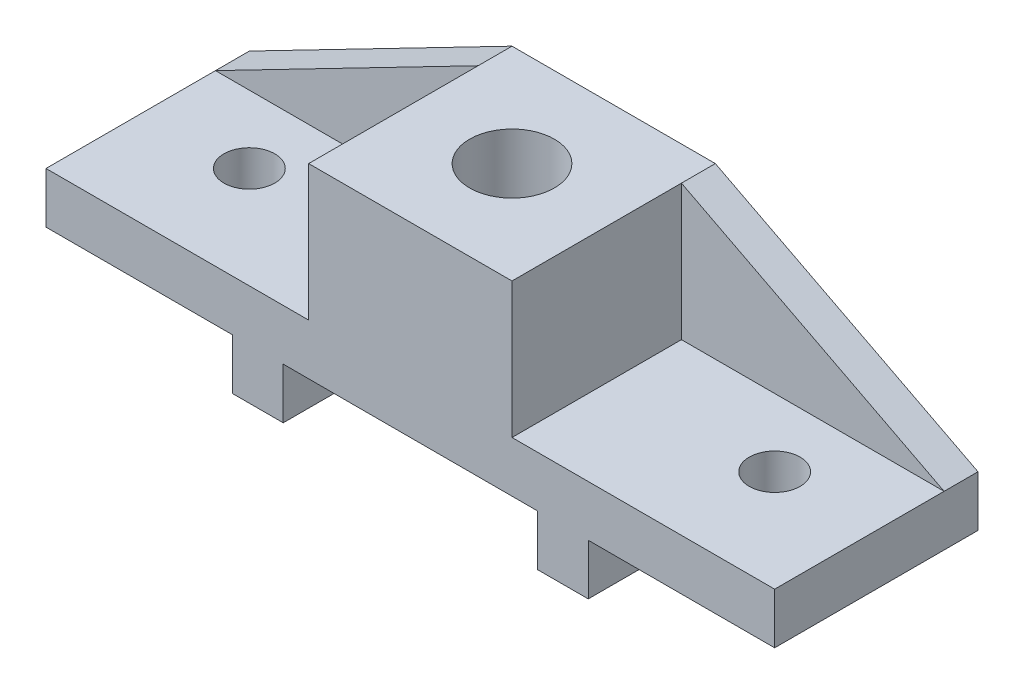
ISO-10303-21;
HEADER;
FILE_DESCRIPTION(('STEP AP214'),'2;1');
FILE_NAME('part.step','',(''),(''),'','','');
FILE_SCHEMA(('AUTOMOTIVE_DESIGN { 1 0 10303 214 1 1 1 1 }'));
ENDSEC;
DATA;
#1=APPLICATION_CONTEXT('core data for automotive mechanical design processes');
#2=APPLICATION_PROTOCOL_DEFINITION('international standard','automotive_design',2000,#1);
#3=PRODUCT_CONTEXT('',#1,'mechanical');
#4=PRODUCT('Part','Part','',(#3));
#5=PRODUCT_RELATED_PRODUCT_CATEGORY('part','',(#4));
#6=PRODUCT_DEFINITION_FORMATION('','',#4);
#7=PRODUCT_DEFINITION_CONTEXT('part definition',#1,'design');
#8=PRODUCT_DEFINITION('design','',#6,#7);
#9=PRODUCT_DEFINITION_SHAPE('','',#8);
#10=(LENGTH_UNIT() NAMED_UNIT(*) SI_UNIT(.MILLI.,.METRE.));
#11=(NAMED_UNIT(*) PLANE_ANGLE_UNIT() SI_UNIT($,.RADIAN.));
#12=(NAMED_UNIT(*) SI_UNIT($,.STERADIAN.) SOLID_ANGLE_UNIT());
#13=UNCERTAINTY_MEASURE_WITH_UNIT(LENGTH_MEASURE(1.E-05),#10,'distance_accuracy_value','');
#14=(GEOMETRIC_REPRESENTATION_CONTEXT(3) GLOBAL_UNCERTAINTY_ASSIGNED_CONTEXT((#13)) GLOBAL_UNIT_ASSIGNED_CONTEXT((#10,
#11,#12)) REPRESENTATION_CONTEXT('',''));
#15=CARTESIAN_POINT('',(0.,0.,0.));
#16=DIRECTION('',(0.,0.,1.));
#17=DIRECTION('',(1.,0.,0.));
#18=AXIS2_PLACEMENT_3D('',#15,#16,#17);
#19=CARTESIAN_POINT('',(174.625,69.85,-76.2));
#20=DIRECTION('',(1.,0.,0.));
#21=DIRECTION('',(0.,0.,-1.));
#22=AXIS2_PLACEMENT_3D('',#19,#20,#21);
#23=PLANE('',#22);
#24=DIRECTION('',(0.,0.,1.));
#25=VECTOR('',#24,1.);
#26=CARTESIAN_POINT('',(174.625,19.05,-76.2));
#27=LINE('',#26,#25);
#28=CARTESIAN_POINT('',(174.625,19.05,-63.5));
#29=VERTEX_POINT('',#28);
#30=CARTESIAN_POINT('',(174.625,19.05,0.));
#31=VERTEX_POINT('',#30);
#32=EDGE_CURVE('E289',#29,#31,#27,.T.);
#33=ORIENTED_EDGE('',*,*,#32,.F.);
#34=DIRECTION('',(0.,1.,0.));
#35=VECTOR('',#34,1.);
#36=CARTESIAN_POINT('',(174.625,69.85,-63.5));
#37=LINE('',#36,#35);
#38=CARTESIAN_POINT('',(174.625,69.85,-63.5));
#39=VERTEX_POINT('',#38);
#40=EDGE_CURVE('E50',#29,#39,#37,.T.);
#41=ORIENTED_EDGE('',*,*,#40,.T.);
#42=DIRECTION('',(0.,0.,1.));
#43=VECTOR('',#42,1.);
#44=CARTESIAN_POINT('',(174.625,69.85,-76.2));
#45=LINE('',#44,#43);
#46=CARTESIAN_POINT('',(174.625,69.85,0.));
#47=VERTEX_POINT('',#46);
#48=EDGE_CURVE('E178',#39,#47,#45,.T.);
#49=ORIENTED_EDGE('',*,*,#48,.T.);
#50=DIRECTION('',(0.,1.,0.));
#51=VECTOR('',#50,1.);
#52=CARTESIAN_POINT('',(174.625,69.85,0.));
#53=LINE('',#52,#51);
#54=EDGE_CURVE('E274',#31,#47,#53,.T.);
#55=ORIENTED_EDGE('',*,*,#54,.F.);
#56=EDGE_LOOP('',(#33,#41,#49,#55));
#57=FACE_BOUND('',#56,.T.);
#58=ADVANCED_FACE('F33',(#57),#23,.T.);
#59=CARTESIAN_POINT('',(174.625,19.05,-76.2));
#60=DIRECTION('',(0.,1.,0.));
#61=DIRECTION('',(0.,0.,1.));
#62=AXIS2_PLACEMENT_3D('',#59,#60,#61);
#63=PLANE('',#62);
#64=CARTESIAN_POINT('',(234.95,19.05,-38.1));
#65=DIRECTION('',(0.,1.,0.));
#66=DIRECTION('',(0.,0.,1.));
#67=AXIS2_PLACEMENT_3D('',#64,#65,#66);
#68=CIRCLE('',#67,9.525);
#69=CARTESIAN_POINT('',(234.95,19.05,-28.575));
#70=VERTEX_POINT('',#69);
#71=EDGE_CURVE('E313',#70,#70,#68,.T.);
#72=ORIENTED_EDGE('',*,*,#71,.F.);
#73=EDGE_LOOP('',(#72));
#74=FACE_BOUND('',#73,.T.);
#75=DIRECTION('',(0.,0.,1.));
#76=VECTOR('',#75,1.);
#77=CARTESIAN_POINT('',(273.05,19.05,-76.2));
#78=LINE('',#77,#76);
#79=CARTESIAN_POINT('',(273.05,19.05,-63.5));
#80=VERTEX_POINT('',#79);
#81=CARTESIAN_POINT('',(273.05,19.05,0.));
#82=VERTEX_POINT('',#81);
#83=EDGE_CURVE('E292',#80,#82,#78,.T.);
#84=ORIENTED_EDGE('',*,*,#83,.F.);
#85=DIRECTION('',(-1.,0.,0.));
#86=VECTOR('',#85,1.);
#87=CARTESIAN_POINT('',(174.625,19.05,-63.5));
#88=LINE('',#87,#86);
#89=EDGE_CURVE('E58',#80,#29,#88,.T.);
#90=ORIENTED_EDGE('',*,*,#89,.T.);
#91=ORIENTED_EDGE('',*,*,#32,.T.);
#92=DIRECTION('',(-1.,0.,0.));
#93=VECTOR('',#92,1.);
#94=CARTESIAN_POINT('',(174.625,19.05,0.));
#95=LINE('',#94,#93);
#96=EDGE_CURVE('E271',#82,#31,#95,.T.);
#97=ORIENTED_EDGE('',*,*,#96,.F.);
#98=EDGE_LOOP('',(#84,#90,#91,#97));
#99=FACE_BOUND('',#98,.T.);
#100=ADVANCED_FACE('F341',(#74,#99),#63,.T.);
#101=CARTESIAN_POINT('',(98.425,19.05,-76.2));
#102=DIRECTION('',(0.,1.,0.));
#103=DIRECTION('',(-1.,0.,0.));
#104=AXIS2_PLACEMENT_3D('',#101,#102,#103);
#105=PLANE('',#104);
#106=CARTESIAN_POINT('',(38.1,19.05,-38.1));
#107=DIRECTION('',(0.,1.,0.));
#108=DIRECTION('',(0.,0.,1.));
#109=AXIS2_PLACEMENT_3D('',#106,#107,#108);
#110=CIRCLE('',#109,9.525);
#111=CARTESIAN_POINT('',(38.1,19.05,-28.575));
#112=VERTEX_POINT('',#111);
#113=EDGE_CURVE('E318',#112,#112,#110,.T.);
#114=ORIENTED_EDGE('',*,*,#113,.F.);
#115=EDGE_LOOP('',(#114));
#116=FACE_BOUND('',#115,.T.);
#117=DIRECTION('',(0.,0.,1.));
#118=VECTOR('',#117,1.);
#119=CARTESIAN_POINT('',(98.425,19.05,-76.2));
#120=LINE('',#119,#118);
#121=CARTESIAN_POINT('',(98.425,19.05,-63.5));
#122=VERTEX_POINT('',#121);
#123=CARTESIAN_POINT('',(98.425,19.05,0.));
#124=VERTEX_POINT('',#123);
#125=EDGE_CURVE('E285',#122,#124,#120,.T.);
#126=ORIENTED_EDGE('',*,*,#125,.F.);
#127=DIRECTION('',(-1.,0.,0.));
#128=VECTOR('',#127,1.);
#129=CARTESIAN_POINT('',(98.425,19.05,-63.5));
#130=LINE('',#129,#128);
#131=CARTESIAN_POINT('',(0.,19.05,-63.5));
#132=VERTEX_POINT('',#131);
#133=EDGE_CURVE('E200',#122,#132,#130,.T.);
#134=ORIENTED_EDGE('',*,*,#133,.T.);
#135=DIRECTION('',(0.,0.,1.));
#136=VECTOR('',#135,1.);
#137=CARTESIAN_POINT('',(0.,19.05,-76.2));
#138=LINE('',#137,#136);
#139=CARTESIAN_POINT('',(0.,19.05,0.));
#140=VERTEX_POINT('',#139);
#141=EDGE_CURVE('E42',#132,#140,#138,.T.);
#142=ORIENTED_EDGE('',*,*,#141,.T.);
#143=DIRECTION('',(-1.,0.,0.));
#144=VECTOR('',#143,1.);
#145=CARTESIAN_POINT('',(98.425,19.05,0.));
#146=LINE('',#145,#144);
#147=EDGE_CURVE('E211',#124,#140,#146,.T.);
#148=ORIENTED_EDGE('',*,*,#147,.F.);
#149=EDGE_LOOP('',(#126,#134,#142,#148));
#150=FACE_BOUND('',#149,.T.);
#151=ADVANCED_FACE('F346',(#116,#150),#105,.T.);
#152=CARTESIAN_POINT('',(98.425,69.85,-76.2));
#153=DIRECTION('',(-1.,0.,0.));
#154=DIRECTION('',(0.,0.,1.));
#155=AXIS2_PLACEMENT_3D('',#152,#153,#154);
#156=PLANE('',#155);
#157=DIRECTION('',(0.,0.,1.));
#158=VECTOR('',#157,1.);
#159=CARTESIAN_POINT('',(98.425,69.85,-76.2));
#160=LINE('',#159,#158);
#161=CARTESIAN_POINT('',(98.425,69.85,-63.5));
#162=VERTEX_POINT('',#161);
#163=CARTESIAN_POINT('',(98.425,69.85,0.));
#164=VERTEX_POINT('',#163);
#165=EDGE_CURVE('E182',#162,#164,#160,.T.);
#166=ORIENTED_EDGE('',*,*,#165,.F.);
#167=DIRECTION('',(0.,-1.,0.));
#168=VECTOR('',#167,1.);
#169=CARTESIAN_POINT('',(98.425,69.85,-63.5));
#170=LINE('',#169,#168);
#171=EDGE_CURVE('E198',#162,#122,#170,.T.);
#172=ORIENTED_EDGE('',*,*,#171,.T.);
#173=ORIENTED_EDGE('',*,*,#125,.T.);
#174=DIRECTION('',(0.,-1.,0.));
#175=VECTOR('',#174,1.);
#176=CARTESIAN_POINT('',(98.425,69.85,0.));
#177=LINE('',#176,#175);
#178=EDGE_CURVE('E280',#164,#124,#177,.T.);
#179=ORIENTED_EDGE('',*,*,#178,.F.);
#180=EDGE_LOOP('',(#166,#172,#173,#179));
#181=FACE_BOUND('',#180,.T.);
#182=ADVANCED_FACE('F428',(#181),#156,.T.);
#183=CARTESIAN_POINT('',(0.,0.,-76.2));
#184=DIRECTION('',(-1.,0.,0.));
#185=DIRECTION('',(0.,0.,1.));
#186=AXIS2_PLACEMENT_3D('',#183,#184,#185);
#187=PLANE('',#186);
#188=DIRECTION('',(0.,-1.,0.));
#189=VECTOR('',#188,1.);
#190=CARTESIAN_POINT('',(0.,0.,0.));
#191=LINE('',#190,#189);
#192=CARTESIAN_POINT('',(0.,0.,0.));
#193=VERTEX_POINT('',#192);
#194=EDGE_CURVE('E205',#140,#193,#191,.T.);
#195=ORIENTED_EDGE('',*,*,#194,.F.);
#196=ORIENTED_EDGE('',*,*,#141,.F.);
#197=CARTESIAN_POINT('',(0.,19.05,-76.2));
#198=VERTEX_POINT('',#197);
#199=EDGE_CURVE('E11',#198,#132,#138,.T.);
#200=ORIENTED_EDGE('',*,*,#199,.F.);
#201=DIRECTION('',(0.,-1.,0.));
#202=VECTOR('',#201,1.);
#203=CARTESIAN_POINT('',(0.,0.,-76.2));
#204=LINE('',#203,#202);
#205=CARTESIAN_POINT('',(0.,0.,-76.2));
#206=VERTEX_POINT('',#205);
#207=EDGE_CURVE('E207',#198,#206,#204,.T.);
#208=ORIENTED_EDGE('',*,*,#207,.T.);
#209=DIRECTION('',(0.,0.,1.));
#210=VECTOR('',#209,1.);
#211=CARTESIAN_POINT('',(0.,0.,-76.2));
#212=LINE('',#211,#210);
#213=EDGE_CURVE('E171',#206,#193,#212,.T.);
#214=ORIENTED_EDGE('',*,*,#213,.T.);
#215=EDGE_LOOP('',(#195,#196,#200,#208,#214));
#216=FACE_BOUND('',#215,.T.);
#217=ADVANCED_FACE('F35',(#216),#187,.T.);
#218=CARTESIAN_POINT('',(98.425,69.85,-76.2));
#219=DIRECTION('',(0.,1.,0.));
#220=DIRECTION('',(-1.,0.,0.));
#221=AXIS2_PLACEMENT_3D('',#218,#219,#220);
#222=PLANE('',#221);
#223=CARTESIAN_POINT('',(136.525,69.85,-38.1));
#224=DIRECTION('',(0.,1.,0.));
#225=DIRECTION('',(-1.,0.,0.));
#226=AXIS2_PLACEMENT_3D('',#223,#224,#225);
#227=CIRCLE('',#226,15.875);
#228=CARTESIAN_POINT('',(120.65,69.85,-38.1));
#229=VERTEX_POINT('',#228);
#230=EDGE_CURVE('E192',#229,#229,#227,.T.);
#231=ORIENTED_EDGE('',*,*,#230,.F.);
#232=EDGE_LOOP('',(#231));
#233=FACE_BOUND('',#232,.T.);
#234=DIRECTION('',(-1.,0.,0.));
#235=VECTOR('',#234,1.);
#236=CARTESIAN_POINT('',(98.425,69.85,0.));
#237=LINE('',#236,#235);
#238=EDGE_CURVE('E277',#47,#164,#237,.T.);
#239=ORIENTED_EDGE('',*,*,#238,.F.);
#240=ORIENTED_EDGE('',*,*,#48,.F.);
#241=CARTESIAN_POINT('',(174.625,69.85,-76.2));
#242=VERTEX_POINT('',#241);
#243=EDGE_CURVE('E175',#242,#39,#45,.T.);
#244=ORIENTED_EDGE('',*,*,#243,.F.);
#245=DIRECTION('',(-1.,0.,0.));
#246=VECTOR('',#245,1.);
#247=CARTESIAN_POINT('',(98.425,69.85,-76.2));
#248=LINE('',#247,#246);
#249=CARTESIAN_POINT('',(98.425,69.85,-76.2));
#250=VERTEX_POINT('',#249);
#251=EDGE_CURVE('E160',#242,#250,#248,.T.);
#252=ORIENTED_EDGE('',*,*,#251,.T.);
#253=EDGE_CURVE('E287',#250,#162,#160,.T.);
#254=ORIENTED_EDGE('',*,*,#253,.T.);
#255=ORIENTED_EDGE('',*,*,#165,.T.);
#256=EDGE_LOOP('',(#239,#240,#244,#252,#254,#255));
#257=FACE_BOUND('',#256,.T.);
#258=ADVANCED_FACE('F177',(#233,#257),#222,.T.);
#259=CARTESIAN_POINT('',(273.05,0.,-76.2));
#260=DIRECTION('',(1.,0.,0.));
#261=DIRECTION('',(0.,0.,-1.));
#262=AXIS2_PLACEMENT_3D('',#259,#260,#261);
#263=PLANE('',#262);
#264=DIRECTION('',(0.,1.,0.));
#265=VECTOR('',#264,1.);
#266=CARTESIAN_POINT('',(273.05,0.,0.));
#267=LINE('',#266,#265);
#268=CARTESIAN_POINT('',(273.05,0.,0.));
#269=VERTEX_POINT('',#268);
#270=EDGE_CURVE('E268',#269,#82,#267,.T.);
#271=ORIENTED_EDGE('',*,*,#270,.F.);
#272=DIRECTION('',(0.,0.,1.));
#273=VECTOR('',#272,1.);
#274=CARTESIAN_POINT('',(273.05,0.,-76.2));
#275=LINE('',#274,#273);
#276=CARTESIAN_POINT('',(273.05,0.,-76.2));
#277=VERTEX_POINT('',#276);
#278=EDGE_CURVE('E293',#277,#269,#275,.T.);
#279=ORIENTED_EDGE('',*,*,#278,.F.);
#280=DIRECTION('',(0.,1.,0.));
#281=VECTOR('',#280,1.);
#282=CARTESIAN_POINT('',(273.05,0.,-76.2));
#283=LINE('',#282,#281);
#284=CARTESIAN_POINT('',(273.05,19.05,-76.2));
#285=VERTEX_POINT('',#284);
#286=EDGE_CURVE('E172',#277,#285,#283,.T.);
#287=ORIENTED_EDGE('',*,*,#286,.T.);
#288=EDGE_CURVE('E187',#285,#80,#78,.T.);
#289=ORIENTED_EDGE('',*,*,#288,.T.);
#290=ORIENTED_EDGE('',*,*,#83,.T.);
#291=EDGE_LOOP('',(#271,#279,#287,#289,#290));
#292=FACE_BOUND('',#291,.T.);
#293=ADVANCED_FACE('F352',(#292),#263,.T.);
#294=CARTESIAN_POINT('',(203.2,0.,-76.2));
#295=DIRECTION('',(0.,-1.,0.));
#296=DIRECTION('',(0.,0.,-1.));
#297=AXIS2_PLACEMENT_3D('',#294,#295,#296);
#298=PLANE('',#297);
#299=CARTESIAN_POINT('',(234.95,0.,-38.1));
#300=DIRECTION('',(0.,-1.,0.));
#301=DIRECTION('',(0.,0.,-1.));
#302=AXIS2_PLACEMENT_3D('',#299,#300,#301);
#303=CIRCLE('',#302,9.525);
#304=CARTESIAN_POINT('',(234.95,0.,-47.625));
#305=VERTEX_POINT('',#304);
#306=EDGE_CURVE('E37',#305,#305,#303,.T.);
#307=ORIENTED_EDGE('',*,*,#306,.F.);
#308=EDGE_LOOP('',(#307));
#309=FACE_BOUND('',#308,.T.);
#310=DIRECTION('',(1.,0.,0.));
#311=VECTOR('',#310,1.);
#312=CARTESIAN_POINT('',(203.2,0.,0.));
#313=LINE('',#312,#311);
#314=CARTESIAN_POINT('',(203.2,0.,0.));
#315=VERTEX_POINT('',#314);
#316=EDGE_CURVE('E265',#315,#269,#313,.T.);
#317=ORIENTED_EDGE('',*,*,#316,.F.);
#318=DIRECTION('',(0.,0.,1.));
#319=VECTOR('',#318,1.);
#320=CARTESIAN_POINT('',(203.2,0.,-76.2));
#321=LINE('',#320,#319);
#322=CARTESIAN_POINT('',(203.2,0.,-76.2));
#323=VERTEX_POINT('',#322);
#324=EDGE_CURVE('E295',#323,#315,#321,.T.);
#325=ORIENTED_EDGE('',*,*,#324,.F.);
#326=DIRECTION('',(1.,0.,0.));
#327=VECTOR('',#326,1.);
#328=CARTESIAN_POINT('',(203.2,0.,-76.2));
#329=LINE('',#328,#327);
#330=EDGE_CURVE('E235',#323,#277,#329,.T.);
#331=ORIENTED_EDGE('',*,*,#330,.T.);
#332=ORIENTED_EDGE('',*,*,#278,.T.);
#333=EDGE_LOOP('',(#317,#325,#331,#332));
#334=FACE_BOUND('',#333,.T.);
#335=ADVANCED_FACE('F355',(#309,#334),#298,.T.);
#336=CARTESIAN_POINT('',(203.2,-19.05,-76.2));
#337=DIRECTION('',(1.,0.,0.));
#338=DIRECTION('',(0.,1.,0.));
#339=AXIS2_PLACEMENT_3D('',#336,#337,#338);
#340=PLANE('',#339);
#341=DIRECTION('',(0.,1.,0.));
#342=VECTOR('',#341,1.);
#343=CARTESIAN_POINT('',(203.2,-19.05,0.));
#344=LINE('',#343,#342);
#345=CARTESIAN_POINT('',(203.2,-19.05,0.));
#346=VERTEX_POINT('',#345);
#347=EDGE_CURVE('E262',#346,#315,#344,.T.);
#348=ORIENTED_EDGE('',*,*,#347,.F.);
#349=DIRECTION('',(0.,0.,1.));
#350=VECTOR('',#349,1.);
#351=CARTESIAN_POINT('',(203.2,-19.05,-76.2));
#352=LINE('',#351,#350);
#353=CARTESIAN_POINT('',(203.2,-19.05,-76.2));
#354=VERTEX_POINT('',#353);
#355=EDGE_CURVE('E297',#354,#346,#352,.T.);
#356=ORIENTED_EDGE('',*,*,#355,.F.);
#357=DIRECTION('',(0.,1.,0.));
#358=VECTOR('',#357,1.);
#359=CARTESIAN_POINT('',(203.2,-19.05,-76.2));
#360=LINE('',#359,#358);
#361=EDGE_CURVE('E232',#354,#323,#360,.T.);
#362=ORIENTED_EDGE('',*,*,#361,.T.);
#363=ORIENTED_EDGE('',*,*,#324,.T.);
#364=EDGE_LOOP('',(#348,#356,#362,#363));
#365=FACE_BOUND('',#364,.T.);
#366=ADVANCED_FACE('F359',(#365),#340,.T.);
#367=CARTESIAN_POINT('',(184.15,-19.05,-76.2));
#368=DIRECTION('',(0.,-1.,0.));
#369=DIRECTION('',(0.,0.,-1.));
#370=AXIS2_PLACEMENT_3D('',#367,#368,#369);
#371=PLANE('',#370);
#372=DIRECTION('',(1.,0.,0.));
#373=VECTOR('',#372,1.);
#374=CARTESIAN_POINT('',(184.15,-19.05,0.));
#375=LINE('',#374,#373);
#376=CARTESIAN_POINT('',(184.15,-19.05,0.));
#377=VERTEX_POINT('',#376);
#378=EDGE_CURVE('E259',#377,#346,#375,.T.);
#379=ORIENTED_EDGE('',*,*,#378,.F.);
#380=DIRECTION('',(0.,0.,1.));
#381=VECTOR('',#380,1.);
#382=CARTESIAN_POINT('',(184.15,-19.05,-76.2));
#383=LINE('',#382,#381);
#384=CARTESIAN_POINT('',(184.15,-19.05,-76.2));
#385=VERTEX_POINT('',#384);
#386=EDGE_CURVE('E299',#385,#377,#383,.T.);
#387=ORIENTED_EDGE('',*,*,#386,.F.);
#388=DIRECTION('',(1.,0.,0.));
#389=VECTOR('',#388,1.);
#390=CARTESIAN_POINT('',(184.15,-19.05,-76.2));
#391=LINE('',#390,#389);
#392=EDGE_CURVE('E229',#385,#354,#391,.T.);
#393=ORIENTED_EDGE('',*,*,#392,.T.);
#394=ORIENTED_EDGE('',*,*,#355,.T.);
#395=EDGE_LOOP('',(#379,#387,#393,#394));
#396=FACE_BOUND('',#395,.T.);
#397=ADVANCED_FACE('F363',(#396),#371,.T.);
#398=CARTESIAN_POINT('',(184.15,0.,-76.2));
#399=DIRECTION('',(-1.,0.,0.));
#400=DIRECTION('',(0.,-1.,0.));
#401=AXIS2_PLACEMENT_3D('',#398,#399,#400);
#402=PLANE('',#401);
#403=DIRECTION('',(0.,-1.,0.));
#404=VECTOR('',#403,1.);
#405=CARTESIAN_POINT('',(184.15,0.,0.));
#406=LINE('',#405,#404);
#407=CARTESIAN_POINT('',(184.15,0.,0.));
#408=VERTEX_POINT('',#407);
#409=EDGE_CURVE('E256',#408,#377,#406,.T.);
#410=ORIENTED_EDGE('',*,*,#409,.F.);
#411=DIRECTION('',(0.,0.,1.));
#412=VECTOR('',#411,1.);
#413=CARTESIAN_POINT('',(184.15,0.,-76.2));
#414=LINE('',#413,#412);
#415=CARTESIAN_POINT('',(184.15,0.,-76.2));
#416=VERTEX_POINT('',#415);
#417=EDGE_CURVE('E301',#416,#408,#414,.T.);
#418=ORIENTED_EDGE('',*,*,#417,.F.);
#419=DIRECTION('',(0.,-1.,0.));
#420=VECTOR('',#419,1.);
#421=CARTESIAN_POINT('',(184.15,0.,-76.2));
#422=LINE('',#421,#420);
#423=EDGE_CURVE('E226',#416,#385,#422,.T.);
#424=ORIENTED_EDGE('',*,*,#423,.T.);
#425=ORIENTED_EDGE('',*,*,#386,.T.);
#426=EDGE_LOOP('',(#410,#418,#424,#425));
#427=FACE_BOUND('',#426,.T.);
#428=ADVANCED_FACE('F367',(#427),#402,.T.);
#429=CARTESIAN_POINT('',(88.9,0.,-76.2));
#430=DIRECTION('',(0.,-1.,0.));
#431=DIRECTION('',(0.,0.,-1.));
#432=AXIS2_PLACEMENT_3D('',#429,#430,#431);
#433=PLANE('',#432);
#434=CARTESIAN_POINT('',(136.525,0.,-38.1));
#435=DIRECTION('',(0.,-1.,0.));
#436=DIRECTION('',(0.,0.,-1.));
#437=AXIS2_PLACEMENT_3D('',#434,#435,#436);
#438=CIRCLE('',#437,15.875);
#439=CARTESIAN_POINT('',(120.65,0.,-38.1));
#440=VERTEX_POINT('',#439);
#441=EDGE_CURVE('E188',#440,#440,#438,.T.);
#442=ORIENTED_EDGE('',*,*,#441,.F.);
#443=EDGE_LOOP('',(#442));
#444=FACE_BOUND('',#443,.T.);
#445=DIRECTION('',(1.,0.,0.));
#446=VECTOR('',#445,1.);
#447=CARTESIAN_POINT('',(88.9,0.,0.));
#448=LINE('',#447,#446);
#449=CARTESIAN_POINT('',(88.9,0.,0.));
#450=VERTEX_POINT('',#449);
#451=EDGE_CURVE('E253',#450,#408,#448,.T.);
#452=ORIENTED_EDGE('',*,*,#451,.F.);
#453=DIRECTION('',(0.,0.,1.));
#454=VECTOR('',#453,1.);
#455=CARTESIAN_POINT('',(88.9,0.,-76.2));
#456=LINE('',#455,#454);
#457=CARTESIAN_POINT('',(88.9,0.,-76.2));
#458=VERTEX_POINT('',#457);
#459=EDGE_CURVE('E303',#458,#450,#456,.T.);
#460=ORIENTED_EDGE('',*,*,#459,.F.);
#461=DIRECTION('',(1.,0.,0.));
#462=VECTOR('',#461,1.);
#463=CARTESIAN_POINT('',(88.9,0.,-76.2));
#464=LINE('',#463,#462);
#465=EDGE_CURVE('E223',#458,#416,#464,.T.);
#466=ORIENTED_EDGE('',*,*,#465,.T.);
#467=ORIENTED_EDGE('',*,*,#417,.T.);
#468=EDGE_LOOP('',(#452,#460,#466,#467));
#469=FACE_BOUND('',#468,.T.);
#470=ADVANCED_FACE('F371',(#444,#469),#433,.T.);
#471=CARTESIAN_POINT('',(88.9,-19.05,-76.2));
#472=DIRECTION('',(1.,0.,0.));
#473=DIRECTION('',(0.,0.,-1.));
#474=AXIS2_PLACEMENT_3D('',#471,#472,#473);
#475=PLANE('',#474);
#476=DIRECTION('',(0.,1.,0.));
#477=VECTOR('',#476,1.);
#478=CARTESIAN_POINT('',(88.9,-19.05,0.));
#479=LINE('',#478,#477);
#480=CARTESIAN_POINT('',(88.9,-19.05,0.));
#481=VERTEX_POINT('',#480);
#482=EDGE_CURVE('E250',#481,#450,#479,.T.);
#483=ORIENTED_EDGE('',*,*,#482,.F.);
#484=DIRECTION('',(0.,0.,1.));
#485=VECTOR('',#484,1.);
#486=CARTESIAN_POINT('',(88.9,-19.05,-76.2));
#487=LINE('',#486,#485);
#488=CARTESIAN_POINT('',(88.9,-19.05,-76.2));
#489=VERTEX_POINT('',#488);
#490=EDGE_CURVE('E305',#489,#481,#487,.T.);
#491=ORIENTED_EDGE('',*,*,#490,.F.);
#492=DIRECTION('',(0.,1.,0.));
#493=VECTOR('',#492,1.);
#494=CARTESIAN_POINT('',(88.9,-19.05,-76.2));
#495=LINE('',#494,#493);
#496=EDGE_CURVE('E220',#489,#458,#495,.T.);
#497=ORIENTED_EDGE('',*,*,#496,.T.);
#498=ORIENTED_EDGE('',*,*,#459,.T.);
#499=EDGE_LOOP('',(#483,#491,#497,#498));
#500=FACE_BOUND('',#499,.T.);
#501=ADVANCED_FACE('F375',(#500),#475,.T.);
#502=CARTESIAN_POINT('',(69.85,-19.05,-76.2));
#503=DIRECTION('',(0.,-1.,0.));
#504=DIRECTION('',(1.,0.,0.));
#505=AXIS2_PLACEMENT_3D('',#502,#503,#504);
#506=PLANE('',#505);
#507=DIRECTION('',(1.,0.,0.));
#508=VECTOR('',#507,1.);
#509=CARTESIAN_POINT('',(69.85,-19.05,0.));
#510=LINE('',#509,#508);
#511=CARTESIAN_POINT('',(69.85,-19.05,0.));
#512=VERTEX_POINT('',#511);
#513=EDGE_CURVE('E247',#512,#481,#510,.T.);
#514=ORIENTED_EDGE('',*,*,#513,.F.);
#515=DIRECTION('',(0.,0.,1.));
#516=VECTOR('',#515,1.);
#517=CARTESIAN_POINT('',(69.85,-19.05,-76.2));
#518=LINE('',#517,#516);
#519=CARTESIAN_POINT('',(69.85,-19.05,-76.2));
#520=VERTEX_POINT('',#519);
#521=EDGE_CURVE('E307',#520,#512,#518,.T.);
#522=ORIENTED_EDGE('',*,*,#521,.F.);
#523=DIRECTION('',(1.,0.,0.));
#524=VECTOR('',#523,1.);
#525=CARTESIAN_POINT('',(69.85,-19.05,-76.2));
#526=LINE('',#525,#524);
#527=EDGE_CURVE('E217',#520,#489,#526,.T.);
#528=ORIENTED_EDGE('',*,*,#527,.T.);
#529=ORIENTED_EDGE('',*,*,#490,.T.);
#530=EDGE_LOOP('',(#514,#522,#528,#529));
#531=FACE_BOUND('',#530,.T.);
#532=ADVANCED_FACE('F379',(#531),#506,.T.);
#533=CARTESIAN_POINT('',(69.85,0.,-76.2));
#534=DIRECTION('',(-1.,0.,0.));
#535=DIRECTION('',(0.,0.,1.));
#536=AXIS2_PLACEMENT_3D('',#533,#534,#535);
#537=PLANE('',#536);
#538=DIRECTION('',(0.,-1.,0.));
#539=VECTOR('',#538,1.);
#540=CARTESIAN_POINT('',(69.85,0.,0.));
#541=LINE('',#540,#539);
#542=CARTESIAN_POINT('',(69.85,0.,0.));
#543=VERTEX_POINT('',#542);
#544=EDGE_CURVE('E244',#543,#512,#541,.T.);
#545=ORIENTED_EDGE('',*,*,#544,.F.);
#546=DIRECTION('',(0.,0.,1.));
#547=VECTOR('',#546,1.);
#548=CARTESIAN_POINT('',(69.85,0.,-76.2));
#549=LINE('',#548,#547);
#550=CARTESIAN_POINT('',(69.85,0.,-76.2));
#551=VERTEX_POINT('',#550);
#552=EDGE_CURVE('E309',#551,#543,#549,.T.);
#553=ORIENTED_EDGE('',*,*,#552,.F.);
#554=DIRECTION('',(0.,-1.,0.));
#555=VECTOR('',#554,1.);
#556=CARTESIAN_POINT('',(69.85,0.,-76.2));
#557=LINE('',#556,#555);
#558=EDGE_CURVE('E214',#551,#520,#557,.T.);
#559=ORIENTED_EDGE('',*,*,#558,.T.);
#560=ORIENTED_EDGE('',*,*,#521,.T.);
#561=EDGE_LOOP('',(#545,#553,#559,#560));
#562=FACE_BOUND('',#561,.T.);
#563=ADVANCED_FACE('F383',(#562),#537,.T.);
#564=CARTESIAN_POINT('',(0.,0.,-76.2));
#565=DIRECTION('',(0.,-1.,0.));
#566=DIRECTION('',(0.,0.,-1.));
#567=AXIS2_PLACEMENT_3D('',#564,#565,#566);
#568=PLANE('',#567);
#569=CARTESIAN_POINT('',(38.1,0.,-38.1));
#570=DIRECTION('',(0.,-1.,0.));
#571=DIRECTION('',(0.,0.,-1.));
#572=AXIS2_PLACEMENT_3D('',#569,#570,#571);
#573=CIRCLE('',#572,9.525);
#574=CARTESIAN_POINT('',(38.1,0.,-47.625));
#575=VERTEX_POINT('',#574);
#576=EDGE_CURVE('E311',#575,#575,#573,.T.);
#577=ORIENTED_EDGE('',*,*,#576,.F.);
#578=EDGE_LOOP('',(#577));
#579=FACE_BOUND('',#578,.T.);
#580=DIRECTION('',(1.,0.,0.));
#581=VECTOR('',#580,1.);
#582=CARTESIAN_POINT('',(0.,0.,0.));
#583=LINE('',#582,#581);
#584=EDGE_CURVE('E241',#193,#543,#583,.T.);
#585=ORIENTED_EDGE('',*,*,#584,.F.);
#586=ORIENTED_EDGE('',*,*,#213,.F.);
#587=DIRECTION('',(1.,0.,0.));
#588=VECTOR('',#587,1.);
#589=CARTESIAN_POINT('',(0.,0.,-76.2));
#590=LINE('',#589,#588);
#591=EDGE_CURVE('E210',#206,#551,#590,.T.);
#592=ORIENTED_EDGE('',*,*,#591,.T.);
#593=ORIENTED_EDGE('',*,*,#552,.T.);
#594=EDGE_LOOP('',(#585,#586,#592,#593));
#595=FACE_BOUND('',#594,.T.);
#596=ADVANCED_FACE('F386',(#579,#595),#568,.T.);
#597=CARTESIAN_POINT('',(0.,0.,-76.2));
#598=DIRECTION('',(0.,0.,1.));
#599=DIRECTION('',(1.,0.,0.));
#600=AXIS2_PLACEMENT_3D('',#597,#598,#599);
#601=PLANE('',#600);
#602=ORIENTED_EDGE('',*,*,#207,.F.);
#603=DIRECTION('',(0.888620657054864,0.458642919770252,0.));
#604=VECTOR('',#603,1.);
#605=CARTESIAN_POINT('',(98.425,69.85,-76.2));
#606=LINE('',#605,#604);
#607=EDGE_CURVE('E167',#198,#250,#606,.T.);
#608=ORIENTED_EDGE('',*,*,#607,.T.);
#609=ORIENTED_EDGE('',*,*,#251,.F.);
#610=DIRECTION('',(0.888620657054864,-0.458642919770252,0.));
#611=VECTOR('',#610,1.);
#612=CARTESIAN_POINT('',(273.05,19.05,-76.2));
#613=LINE('',#612,#611);
#614=EDGE_CURVE('E165',#242,#285,#613,.T.);
#615=ORIENTED_EDGE('',*,*,#614,.T.);
#616=ORIENTED_EDGE('',*,*,#286,.F.);
#617=ORIENTED_EDGE('',*,*,#330,.F.);
#618=ORIENTED_EDGE('',*,*,#361,.F.);
#619=ORIENTED_EDGE('',*,*,#392,.F.);
#620=ORIENTED_EDGE('',*,*,#423,.F.);
#621=ORIENTED_EDGE('',*,*,#465,.F.);
#622=ORIENTED_EDGE('',*,*,#496,.F.);
#623=ORIENTED_EDGE('',*,*,#527,.F.);
#624=ORIENTED_EDGE('',*,*,#558,.F.);
#625=ORIENTED_EDGE('',*,*,#591,.F.);
#626=EDGE_LOOP('',(#602,#608,#609,#615,#616,#617,#618,#619,#620,#621,#622,#623,#624,#625));
#627=FACE_BOUND('',#626,.T.);
#628=ADVANCED_FACE('F162',(#627),#601,.F.);
#629=CARTESIAN_POINT('',(0.,0.,0.));
#630=DIRECTION('',(0.,0.,1.));
#631=DIRECTION('',(1.,0.,0.));
#632=AXIS2_PLACEMENT_3D('',#629,#630,#631);
#633=PLANE('',#632);
#634=ORIENTED_EDGE('',*,*,#194,.T.);
#635=ORIENTED_EDGE('',*,*,#584,.T.);
#636=ORIENTED_EDGE('',*,*,#544,.T.);
#637=ORIENTED_EDGE('',*,*,#513,.T.);
#638=ORIENTED_EDGE('',*,*,#482,.T.);
#639=ORIENTED_EDGE('',*,*,#451,.T.);
#640=ORIENTED_EDGE('',*,*,#409,.T.);
#641=ORIENTED_EDGE('',*,*,#378,.T.);
#642=ORIENTED_EDGE('',*,*,#347,.T.);
#643=ORIENTED_EDGE('',*,*,#316,.T.);
#644=ORIENTED_EDGE('',*,*,#270,.T.);
#645=ORIENTED_EDGE('',*,*,#96,.T.);
#646=ORIENTED_EDGE('',*,*,#54,.T.);
#647=ORIENTED_EDGE('',*,*,#238,.T.);
#648=ORIENTED_EDGE('',*,*,#178,.T.);
#649=ORIENTED_EDGE('',*,*,#147,.T.);
#650=EDGE_LOOP('',(#634,#635,#636,#637,#638,#639,#640,#641,#642,#643,#644,#645,#646,#647,#648,#649));
#651=FACE_BOUND('',#650,.T.);
#652=ADVANCED_FACE('F393',(#651),#633,.T.);
#653=CARTESIAN_POINT('',(98.425,69.85,-63.5));
#654=DIRECTION('',(-0.458642919770252,0.888620657054864,0.));
#655=DIRECTION('',(-0.888620657054864,-0.458642919770252,0.));
#656=AXIS2_PLACEMENT_3D('',#653,#654,#655);
#657=PLANE('',#656);
#658=ORIENTED_EDGE('',*,*,#607,.F.);
#659=ORIENTED_EDGE('',*,*,#199,.T.);
#660=DIRECTION('',(0.888620657054864,0.458642919770252,0.));
#661=VECTOR('',#660,1.);
#662=CARTESIAN_POINT('',(98.425,69.85,-63.5));
#663=LINE('',#662,#661);
#664=EDGE_CURVE('E202',#132,#162,#663,.T.);
#665=ORIENTED_EDGE('',*,*,#664,.T.);
#666=ORIENTED_EDGE('',*,*,#253,.F.);
#667=EDGE_LOOP('',(#658,#659,#665,#666));
#668=FACE_BOUND('',#667,.T.);
#669=ADVANCED_FACE('F435',(#668),#657,.T.);
#670=CARTESIAN_POINT('',(0.,0.,-63.5));
#671=DIRECTION('',(0.,0.,-1.));
#672=DIRECTION('',(-1.,0.,0.));
#673=AXIS2_PLACEMENT_3D('',#670,#671,#672);
#674=PLANE('',#673);
#675=ORIENTED_EDGE('',*,*,#171,.F.);
#676=ORIENTED_EDGE('',*,*,#664,.F.);
#677=ORIENTED_EDGE('',*,*,#133,.F.);
#678=EDGE_LOOP('',(#675,#676,#677));
#679=FACE_BOUND('',#678,.T.);
#680=ADVANCED_FACE('F338',(#679),#674,.F.);
#681=CARTESIAN_POINT('',(273.05,19.05,-63.5));
#682=DIRECTION('',(0.458642919770252,0.888620657054864,0.));
#683=DIRECTION('',(-0.888620657054864,0.458642919770252,0.));
#684=AXIS2_PLACEMENT_3D('',#681,#682,#683);
#685=PLANE('',#684);
#686=ORIENTED_EDGE('',*,*,#614,.F.);
#687=ORIENTED_EDGE('',*,*,#243,.T.);
#688=DIRECTION('',(0.888620657054864,-0.458642919770252,0.));
#689=VECTOR('',#688,1.);
#690=CARTESIAN_POINT('',(273.05,19.05,-63.5));
#691=LINE('',#690,#689);
#692=EDGE_CURVE('E196',#39,#80,#691,.T.);
#693=ORIENTED_EDGE('',*,*,#692,.T.);
#694=ORIENTED_EDGE('',*,*,#288,.F.);
#695=EDGE_LOOP('',(#686,#687,#693,#694));
#696=FACE_BOUND('',#695,.T.);
#697=ADVANCED_FACE('F185',(#696),#685,.T.);
#698=CARTESIAN_POINT('',(0.,0.,-63.5));
#699=DIRECTION('',(0.,0.,-1.));
#700=DIRECTION('',(-1.,0.,0.));
#701=AXIS2_PLACEMENT_3D('',#698,#699,#700);
#702=PLANE('',#701);
#703=ORIENTED_EDGE('',*,*,#89,.F.);
#704=ORIENTED_EDGE('',*,*,#692,.F.);
#705=ORIENTED_EDGE('',*,*,#40,.F.);
#706=EDGE_LOOP('',(#703,#704,#705));
#707=FACE_BOUND('',#706,.T.);
#708=ADVANCED_FACE('F327',(#707),#702,.F.);
#709=CARTESIAN_POINT('',(136.525,-19.0500000000001,-38.1));
#710=DIRECTION('',(0.,1.,0.));
#711=DIRECTION('',(-1.,0.,0.));
#712=AXIS2_PLACEMENT_3D('',#709,#710,#711);
#713=CYLINDRICAL_SURFACE('',#712,15.875);
#714=CARTESIAN_POINT('',(120.65,0.,-38.1));
#715=CARTESIAN_POINT('',(120.65,0.727604166666639,-38.1));
#716=CARTESIAN_POINT('',(120.65,1.4552083333333,-38.1));
#717=CARTESIAN_POINT('',(120.65,2.91041666666664,-38.1));
#718=CARTESIAN_POINT('',(120.65,3.6380208333333,-38.1));
#719=CARTESIAN_POINT('',(120.65,5.09322916666664,-38.1));
#720=CARTESIAN_POINT('',(120.65,5.82083333333331,-38.1));
#721=CARTESIAN_POINT('',(120.65,7.27604166666664,-38.1));
#722=CARTESIAN_POINT('',(120.65,8.00364583333331,-38.1));
#723=CARTESIAN_POINT('',(120.65,9.45885416666664,-38.1));
#724=CARTESIAN_POINT('',(120.65,10.1864583333333,-38.1));
#725=CARTESIAN_POINT('',(120.65,11.6416666666666,-38.1));
#726=CARTESIAN_POINT('',(120.65,12.3692708333333,-38.1));
#727=CARTESIAN_POINT('',(120.65,13.8244791666666,-38.1));
#728=CARTESIAN_POINT('',(120.65,14.5520833333333,-38.1));
#729=CARTESIAN_POINT('',(120.65,16.0072916666666,-38.1));
#730=CARTESIAN_POINT('',(120.65,16.7348958333333,-38.1));
#731=CARTESIAN_POINT('',(120.65,18.1901041666666,-38.1));
#732=CARTESIAN_POINT('',(120.65,18.9177083333333,-38.1));
#733=CARTESIAN_POINT('',(120.65,20.3729166666666,-38.1));
#734=CARTESIAN_POINT('',(120.65,21.1005208333333,-38.1));
#735=CARTESIAN_POINT('',(120.65,22.5557291666666,-38.1));
#736=CARTESIAN_POINT('',(120.65,23.2833333333333,-38.1));
#737=CARTESIAN_POINT('',(120.65,24.7385416666666,-38.1));
#738=CARTESIAN_POINT('',(120.65,25.4661458333333,-38.1));
#739=CARTESIAN_POINT('',(120.65,26.9213541666666,-38.1));
#740=CARTESIAN_POINT('',(120.65,27.6489583333333,-38.1));
#741=CARTESIAN_POINT('',(120.65,29.1041666666666,-38.1));
#742=CARTESIAN_POINT('',(120.65,29.8317708333333,-38.1));
#743=CARTESIAN_POINT('',(120.65,31.2869791666666,-38.1));
#744=CARTESIAN_POINT('',(120.65,32.0145833333333,-38.1));
#745=CARTESIAN_POINT('',(120.65,33.4697916666666,-38.1));
#746=CARTESIAN_POINT('',(120.65,34.1973958333333,-38.1));
#747=CARTESIAN_POINT('',(120.65,35.6526041666666,-38.1));
#748=CARTESIAN_POINT('',(120.65,36.3802083333333,-38.1));
#749=CARTESIAN_POINT('',(120.65,37.8354166666666,-38.1));
#750=CARTESIAN_POINT('',(120.65,38.5630208333333,-38.1));
#751=CARTESIAN_POINT('',(120.65,40.0182291666666,-38.1));
#752=CARTESIAN_POINT('',(120.65,40.7458333333333,-38.1));
#753=CARTESIAN_POINT('',(120.65,42.2010416666666,-38.1));
#754=CARTESIAN_POINT('',(120.65,42.9286458333333,-38.1));
#755=CARTESIAN_POINT('',(120.65,44.3838541666666,-38.1));
#756=CARTESIAN_POINT('',(120.65,45.1114583333333,-38.1));
#757=CARTESIAN_POINT('',(120.65,46.5666666666666,-38.1));
#758=CARTESIAN_POINT('',(120.65,47.2942708333333,-38.1));
#759=CARTESIAN_POINT('',(120.65,48.7494791666666,-38.1));
#760=CARTESIAN_POINT('',(120.65,49.4770833333333,-38.1));
#761=CARTESIAN_POINT('',(120.65,50.9322916666666,-38.1));
#762=CARTESIAN_POINT('',(120.65,51.6598958333333,-38.1));
#763=CARTESIAN_POINT('',(120.65,53.1151041666666,-38.1));
#764=CARTESIAN_POINT('',(120.65,53.8427083333333,-38.1));
#765=CARTESIAN_POINT('',(120.65,55.2979166666666,-38.1));
#766=CARTESIAN_POINT('',(120.65,56.0255208333333,-38.1));
#767=CARTESIAN_POINT('',(120.65,57.4807291666666,-38.1));
#768=CARTESIAN_POINT('',(120.65,58.2083333333333,-38.1));
#769=CARTESIAN_POINT('',(120.65,59.6635416666666,-38.1));
#770=CARTESIAN_POINT('',(120.65,60.3911458333333,-38.1));
#771=CARTESIAN_POINT('',(120.65,61.8463541666666,-38.1));
#772=CARTESIAN_POINT('',(120.65,62.5739583333333,-38.1));
#773=CARTESIAN_POINT('',(120.65,64.0291666666666,-38.1));
#774=CARTESIAN_POINT('',(120.65,64.7567708333333,-38.1));
#775=CARTESIAN_POINT('',(120.65,66.2119791666666,-38.1));
#776=CARTESIAN_POINT('',(120.65,66.9395833333333,-38.1));
#777=CARTESIAN_POINT('',(120.65,68.3947916666666,-38.1));
#778=CARTESIAN_POINT('',(120.65,69.1223958333333,-38.1));
#779=CARTESIAN_POINT('',(120.65,69.85,-38.1));
#780=B_SPLINE_CURVE_WITH_KNOTS('',3,(#714,#715,#716,#717,#718,#719,#720,#721,#722,#723,#724,
#725,#726,#727,#728,#729,#730,#731,#732,#733,#734,#735,#736,#737,#738,#739,#740,#741,#742,#743,
#744,#745,#746,#747,#748,#749,#750,#751,#752,#753,#754,#755,#756,#757,#758,#759,#760,#761,#762,
#763,#764,#765,#766,#767,#768,#769,#770,#771,#772,#773,#774,#775,#776,#777,#778,#779),
.UNSPECIFIED.,.F.,.F.,(4,2,2,2,2,2,2,2,2,2,2,2,2,2,2,2,2,2,2,2,2,2,2,2,2,2,2,2,2,2,2,2,4),(0.,
2.1828125,4.365625,6.5484375,8.73125,10.9140625,13.096875,15.2796875,17.4625,19.6453125,
21.828125,24.0109375,26.19375,28.3765625,30.559375,32.7421875,34.925,37.1078125,39.290625,
41.4734375,43.65625,45.8390625,48.021875,50.2046875,52.3875,54.5703125,56.753125,58.9359375,
61.11875,63.3015625,65.484375,67.6671875,69.85),.UNSPECIFIED.);
#781=EDGE_CURVE('BSEAM329',#440,#229,#780,.T.);
#782=ORIENTED_EDGE('',*,*,#441,.T.);
#783=ORIENTED_EDGE('',*,*,#230,.T.);
#784=ORIENTED_EDGE('',*,*,#781,.T.);
#785=ORIENTED_EDGE('',*,*,#781,.F.);
#786=EDGE_LOOP('',(#782,#784,#783,#785));
#787=FACE_BOUND('',#786,.T.);
#788=ADVANCED_FACE('F329',(#787),#713,.F.);
#789=CARTESIAN_POINT('',(38.1,-19.05,-38.1));
#790=DIRECTION('',(0.,1.,0.));
#791=DIRECTION('',(0.,0.,1.));
#792=AXIS2_PLACEMENT_3D('',#789,#790,#791);
#793=CYLINDRICAL_SURFACE('',#792,9.525);
#794=ORIENTED_EDGE('',*,*,#576,.T.);
#795=EDGE_LOOP('',(#794));
#796=FACE_BOUND('',#795,.T.);
#797=ORIENTED_EDGE('',*,*,#113,.T.);
#798=EDGE_LOOP('',(#797));
#799=FACE_BOUND('',#798,.T.);
#800=ADVANCED_FACE('F335',(#796,#799),#793,.F.);
#801=CARTESIAN_POINT('',(234.95,-19.05,-38.1));
#802=DIRECTION('',(0.,1.,0.));
#803=DIRECTION('',(0.,0.,1.));
#804=AXIS2_PLACEMENT_3D('',#801,#802,#803);
#805=CYLINDRICAL_SURFACE('',#804,9.525);
#806=ORIENTED_EDGE('',*,*,#306,.T.);
#807=EDGE_LOOP('',(#806));
#808=FACE_BOUND('',#807,.T.);
#809=ORIENTED_EDGE('',*,*,#71,.T.);
#810=EDGE_LOOP('',(#809));
#811=FACE_BOUND('',#810,.T.);
#812=ADVANCED_FACE('F562',(#808,#811),#805,.F.);
#813=CLOSED_SHELL('',(#58,#100,#151,#182,#217,#258,#293,#335,#366,#397,#428,#470,#501,#532,#563,
#596,#628,#652,#669,#680,#697,#708,#788,#800,#812));
#814=MANIFOLD_SOLID_BREP('B2',#813);
#815=ADVANCED_BREP_SHAPE_REPRESENTATION('',(#18,#814),#14);
#816=SHAPE_DEFINITION_REPRESENTATION(#9,#815);
ENDSEC;
END-ISO-10303-21;
